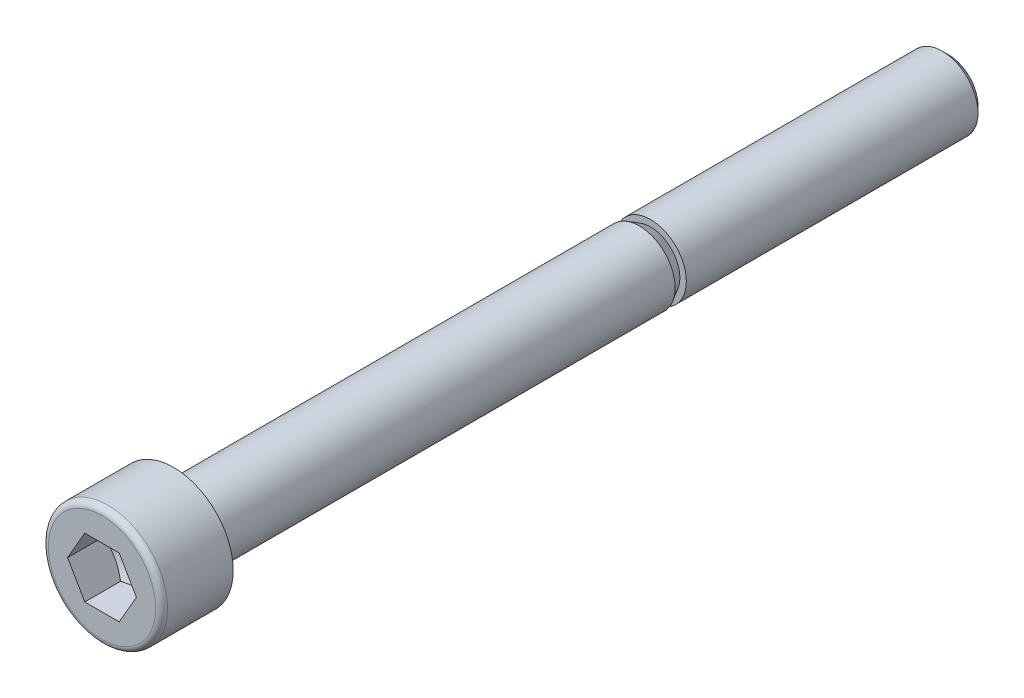
ISO-10303-21;
HEADER;
FILE_DESCRIPTION(('STEP AP214'),'2;1');
FILE_NAME('part.step','',(''),(''),'','','');
FILE_SCHEMA(('AUTOMOTIVE_DESIGN { 1 0 10303 214 1 1 1 1 }'));
ENDSEC;
DATA;
#1=APPLICATION_CONTEXT('core data for automotive mechanical design processes');
#2=APPLICATION_PROTOCOL_DEFINITION('international standard','automotive_design',2000,#1);
#3=PRODUCT_CONTEXT('',#1,'mechanical');
#4=PRODUCT('Part','Part','',(#3));
#5=PRODUCT_RELATED_PRODUCT_CATEGORY('part','',(#4));
#6=PRODUCT_DEFINITION_FORMATION('','',#4);
#7=PRODUCT_DEFINITION_CONTEXT('part definition',#1,'design');
#8=PRODUCT_DEFINITION('design','',#6,#7);
#9=PRODUCT_DEFINITION_SHAPE('','',#8);
#10=(LENGTH_UNIT() NAMED_UNIT(*) SI_UNIT(.MILLI.,.METRE.));
#11=(NAMED_UNIT(*) PLANE_ANGLE_UNIT() SI_UNIT($,.RADIAN.));
#12=(NAMED_UNIT(*) SI_UNIT($,.STERADIAN.) SOLID_ANGLE_UNIT());
#13=UNCERTAINTY_MEASURE_WITH_UNIT(LENGTH_MEASURE(1.E-05),#10,'distance_accuracy_value','');
#14=(GEOMETRIC_REPRESENTATION_CONTEXT(3) GLOBAL_UNCERTAINTY_ASSIGNED_CONTEXT((#13)) GLOBAL_UNIT_ASSIGNED_CONTEXT((#10,
#11,#12)) REPRESENTATION_CONTEXT('',''));
#15=CARTESIAN_POINT('',(0.,0.,0.));
#16=DIRECTION('',(0.,0.,1.));
#17=DIRECTION('',(1.,0.,0.));
#18=AXIS2_PLACEMENT_3D('',#15,#16,#17);
#19=CARTESIAN_POINT('',(0.,0.,6.));
#20=DIRECTION('',(0.,0.,1.));
#21=DIRECTION('',(1.,0.,0.));
#22=AXIS2_PLACEMENT_3D('',#19,#20,#21);
#23=PLANE('',#22);
#24=CARTESIAN_POINT('',(0.,0.,6.));
#25=DIRECTION('',(0.,0.,1.));
#26=DIRECTION('',(1.,0.,0.));
#27=AXIS2_PLACEMENT_3D('',#24,#25,#26);
#28=CIRCLE('',#27,4.5);
#29=CARTESIAN_POINT('',(4.5,0.,6.));
#30=VERTEX_POINT('',#29);
#31=EDGE_CURVE('E11',#30,#30,#28,.T.);
#32=ORIENTED_EDGE('',*,*,#31,.T.);
#33=EDGE_LOOP('',(#32));
#34=FACE_BOUND('',#33,.T.);
#35=DIRECTION('',(1.,0.,0.));
#36=VECTOR('',#35,1.);
#37=CARTESIAN_POINT('',(-1.443375,2.49999883437473,6.));
#38=LINE('',#37,#36);
#39=CARTESIAN_POINT('',(-1.443375,2.49999883437473,6.));
#40=VERTEX_POINT('',#39);
#41=CARTESIAN_POINT('',(1.443375,2.49999883437473,6.));
#42=VERTEX_POINT('',#41);
#43=EDGE_CURVE('E92',#40,#42,#38,.T.);
#44=ORIENTED_EDGE('',*,*,#43,.T.);
#45=DIRECTION('',(0.5,-0.866025403784439,0.));
#46=VECTOR('',#45,1.);
#47=CARTESIAN_POINT('',(1.443375,2.49999883437473,6.));
#48=LINE('',#47,#46);
#49=CARTESIAN_POINT('',(2.88675,0.,6.));
#50=VERTEX_POINT('',#49);
#51=EDGE_CURVE('E31',#42,#50,#48,.T.);
#52=ORIENTED_EDGE('',*,*,#51,.T.);
#53=DIRECTION('',(-0.5,-0.866025403784439,0.));
#54=VECTOR('',#53,1.);
#55=CARTESIAN_POINT('',(2.88675,0.,6.));
#56=LINE('',#55,#54);
#57=CARTESIAN_POINT('',(1.443375,-2.49999883437473,6.));
#58=VERTEX_POINT('',#57);
#59=EDGE_CURVE('E169',#50,#58,#56,.T.);
#60=ORIENTED_EDGE('',*,*,#59,.T.);
#61=DIRECTION('',(-1.,0.,0.));
#62=VECTOR('',#61,1.);
#63=CARTESIAN_POINT('',(1.443375,-2.49999883437473,6.));
#64=LINE('',#63,#62);
#65=CARTESIAN_POINT('',(-1.443375,-2.49999883437473,6.));
#66=VERTEX_POINT('',#65);
#67=EDGE_CURVE('E165',#58,#66,#64,.T.);
#68=ORIENTED_EDGE('',*,*,#67,.T.);
#69=DIRECTION('',(-0.5,0.866025403784439,0.));
#70=VECTOR('',#69,1.);
#71=CARTESIAN_POINT('',(-1.443375,-2.49999883437473,6.));
#72=LINE('',#71,#70);
#73=CARTESIAN_POINT('',(-2.88675,0.,6.));
#74=VERTEX_POINT('',#73);
#75=EDGE_CURVE('E160',#66,#74,#72,.T.);
#76=ORIENTED_EDGE('',*,*,#75,.T.);
#77=DIRECTION('',(0.5,0.866025403784439,0.));
#78=VECTOR('',#77,1.);
#79=CARTESIAN_POINT('',(-2.88675,0.,6.));
#80=LINE('',#79,#78);
#81=EDGE_CURVE('E96',#74,#40,#80,.T.);
#82=ORIENTED_EDGE('',*,*,#81,.T.);
#83=EDGE_LOOP('',(#44,#52,#60,#68,#76,#82));
#84=FACE_BOUND('',#83,.T.);
#85=ADVANCED_FACE('F17',(#34,#84),#23,.T.);
#86=CARTESIAN_POINT('',(0.,0.,5.5));
#87=DIRECTION('',(0.,0.,1.));
#88=DIRECTION('',(1.,0.,0.));
#89=AXIS2_PLACEMENT_3D('',#86,#87,#88);
#90=TOROIDAL_SURFACE('',#89,4.5,0.5);
#91=ORIENTED_EDGE('',*,*,#31,.F.);
#92=EDGE_LOOP('',(#91));
#93=FACE_BOUND('',#92,.T.);
#94=CARTESIAN_POINT('',(0.,0.,5.5));
#95=DIRECTION('',(0.,0.,1.));
#96=DIRECTION('',(1.,0.,0.));
#97=AXIS2_PLACEMENT_3D('',#94,#95,#96);
#98=CIRCLE('',#97,5.);
#99=CARTESIAN_POINT('',(5.,0.,5.5));
#100=VERTEX_POINT('',#99);
#101=EDGE_CURVE('E24',#100,#100,#98,.T.);
#102=ORIENTED_EDGE('',*,*,#101,.T.);
#103=EDGE_LOOP('',(#102));
#104=FACE_BOUND('',#103,.T.);
#105=ADVANCED_FACE('F133',(#93,#104),#90,.T.);
#106=CARTESIAN_POINT('',(0.,0.,6.));
#107=DIRECTION('',(0.,0.,1.));
#108=DIRECTION('',(1.,0.,0.));
#109=AXIS2_PLACEMENT_3D('',#106,#107,#108);
#110=CYLINDRICAL_SURFACE('',#109,5.);
#111=CARTESIAN_POINT('',(0.,0.,0.));
#112=DIRECTION('',(0.,0.,1.));
#113=DIRECTION('',(1.,0.,0.));
#114=AXIS2_PLACEMENT_3D('',#111,#112,#113);
#115=CIRCLE('',#114,5.);
#116=CARTESIAN_POINT('',(5.,0.,0.));
#117=VERTEX_POINT('',#116);
#118=EDGE_CURVE('E128',#117,#117,#115,.T.);
#119=ORIENTED_EDGE('',*,*,#118,.T.);
#120=EDGE_LOOP('',(#119));
#121=FACE_BOUND('',#120,.T.);
#122=ORIENTED_EDGE('',*,*,#101,.F.);
#123=EDGE_LOOP('',(#122));
#124=FACE_BOUND('',#123,.T.);
#125=ADVANCED_FACE('F135',(#121,#124),#110,.T.);
#126=CARTESIAN_POINT('',(0.,5.,0.));
#127=DIRECTION('',(0.,0.,-1.));
#128=DIRECTION('',(-1.,0.,0.));
#129=AXIS2_PLACEMENT_3D('',#126,#127,#128);
#130=PLANE('',#129);
#131=CARTESIAN_POINT('',(0.,0.,0.));
#132=DIRECTION('',(0.,0.,1.));
#133=DIRECTION('',(1.,0.,0.));
#134=AXIS2_PLACEMENT_3D('',#131,#132,#133);
#135=CIRCLE('',#134,3.3);
#136=CARTESIAN_POINT('',(3.3,0.,0.));
#137=VERTEX_POINT('',#136);
#138=EDGE_CURVE('E125',#137,#137,#135,.T.);
#139=ORIENTED_EDGE('',*,*,#138,.T.);
#140=EDGE_LOOP('',(#139));
#141=FACE_BOUND('',#140,.T.);
#142=ORIENTED_EDGE('',*,*,#118,.F.);
#143=EDGE_LOOP('',(#142));
#144=FACE_BOUND('',#143,.T.);
#145=ADVANCED_FACE('F137',(#141,#144),#130,.T.);
#146=CARTESIAN_POINT('',(0.,0.,-0.3));
#147=DIRECTION('',(0.,0.,1.));
#148=DIRECTION('',(1.,0.,0.));
#149=AXIS2_PLACEMENT_3D('',#146,#147,#148);
#150=TOROIDAL_SURFACE('',#149,3.3,0.3);
#151=CARTESIAN_POINT('',(0.,0.,-0.3));
#152=DIRECTION('',(0.,0.,1.));
#153=DIRECTION('',(1.,0.,0.));
#154=AXIS2_PLACEMENT_3D('',#151,#152,#153);
#155=CIRCLE('',#154,3.);
#156=CARTESIAN_POINT('',(3.,0.,-0.3));
#157=VERTEX_POINT('',#156);
#158=EDGE_CURVE('E122',#157,#157,#155,.T.);
#159=ORIENTED_EDGE('',*,*,#158,.T.);
#160=EDGE_LOOP('',(#159));
#161=FACE_BOUND('',#160,.T.);
#162=ORIENTED_EDGE('',*,*,#138,.F.);
#163=EDGE_LOOP('',(#162));
#164=FACE_BOUND('',#163,.T.);
#165=ADVANCED_FACE('F145',(#161,#164),#150,.F.);
#166=CARTESIAN_POINT('',(0.,0.,6.));
#167=DIRECTION('',(0.,0.,1.));
#168=DIRECTION('',(1.,0.,0.));
#169=AXIS2_PLACEMENT_3D('',#166,#167,#168);
#170=CYLINDRICAL_SURFACE('',#169,3.);
#171=CARTESIAN_POINT('',(0.,0.,-39.0625275004033));
#172=DIRECTION('',(0.,0.,1.));
#173=DIRECTION('',(1.,0.,0.));
#174=AXIS2_PLACEMENT_3D('',#171,#172,#173);
#175=CIRCLE('',#174,3.);
#176=CARTESIAN_POINT('',(3.,0.,-39.0625275004033));
#177=VERTEX_POINT('',#176);
#178=EDGE_CURVE('E119',#177,#177,#175,.T.);
#179=ORIENTED_EDGE('',*,*,#178,.T.);
#180=EDGE_LOOP('',(#179));
#181=FACE_BOUND('',#180,.T.);
#182=ORIENTED_EDGE('',*,*,#158,.F.);
#183=EDGE_LOOP('',(#182));
#184=FACE_BOUND('',#183,.T.);
#185=ADVANCED_FACE('F346',(#181,#184),#170,.T.);
#186=CARTESIAN_POINT('',(0.,0.,-39.0625275004033));
#187=DIRECTION('',(0.,0.,1.));
#188=DIRECTION('',(1.,0.,0.));
#189=AXIS2_PLACEMENT_3D('',#186,#187,#188);
#190=CONICAL_SURFACE('',#189,3.,0.523598775598299);
#191=CARTESIAN_POINT('',(0.,0.,-40.));
#192=DIRECTION('',(0.,0.,1.));
#193=DIRECTION('',(1.,0.,0.));
#194=AXIS2_PLACEMENT_3D('',#191,#192,#193);
#195=CIRCLE('',#194,2.45875);
#196=CARTESIAN_POINT('',(2.45875,0.,-40.));
#197=VERTEX_POINT('',#196);
#198=EDGE_CURVE('E116',#197,#197,#195,.T.);
#199=ORIENTED_EDGE('',*,*,#198,.T.);
#200=EDGE_LOOP('',(#199));
#201=FACE_BOUND('',#200,.T.);
#202=ORIENTED_EDGE('',*,*,#178,.F.);
#203=EDGE_LOOP('',(#202));
#204=FACE_BOUND('',#203,.T.);
#205=ADVANCED_FACE('F337',(#201,#204),#190,.T.);
#206=CARTESIAN_POINT('',(0.,2.45875,-40.));
#207=DIRECTION('',(0.,0.,1.));
#208=DIRECTION('',(1.,0.,0.));
#209=AXIS2_PLACEMENT_3D('',#206,#207,#208);
#210=PLANE('',#209);
#211=CARTESIAN_POINT('',(0.,0.,-40.));
#212=DIRECTION('',(0.,0.,1.));
#213=DIRECTION('',(1.,0.,0.));
#214=AXIS2_PLACEMENT_3D('',#211,#212,#213);
#215=CIRCLE('',#214,3.);
#216=CARTESIAN_POINT('',(3.,0.,-40.));
#217=VERTEX_POINT('',#216);
#218=EDGE_CURVE('E113',#217,#217,#215,.T.);
#219=ORIENTED_EDGE('',*,*,#218,.T.);
#220=EDGE_LOOP('',(#219));
#221=FACE_BOUND('',#220,.T.);
#222=ORIENTED_EDGE('',*,*,#198,.F.);
#223=EDGE_LOOP('',(#222));
#224=FACE_BOUND('',#223,.T.);
#225=ADVANCED_FACE('F322',(#221,#224),#210,.T.);
#226=CARTESIAN_POINT('',(0.,0.,6.));
#227=DIRECTION('',(0.,0.,1.));
#228=DIRECTION('',(1.,0.,0.));
#229=AXIS2_PLACEMENT_3D('',#226,#227,#228);
#230=CYLINDRICAL_SURFACE('',#229,3.);
#231=CARTESIAN_POINT('',(0.,0.,-64.45875));
#232=DIRECTION('',(0.,0.,1.));
#233=DIRECTION('',(1.,0.,0.));
#234=AXIS2_PLACEMENT_3D('',#231,#232,#233);
#235=CIRCLE('',#234,3.);
#236=CARTESIAN_POINT('',(3.,0.,-64.45875));
#237=VERTEX_POINT('',#236);
#238=EDGE_CURVE('E110',#237,#237,#235,.T.);
#239=ORIENTED_EDGE('',*,*,#238,.T.);
#240=EDGE_LOOP('',(#239));
#241=FACE_BOUND('',#240,.T.);
#242=ORIENTED_EDGE('',*,*,#218,.F.);
#243=EDGE_LOOP('',(#242));
#244=FACE_BOUND('',#243,.T.);
#245=ADVANCED_FACE('F311',(#241,#244),#230,.T.);
#246=CARTESIAN_POINT('',(0.,0.,-64.45875));
#247=DIRECTION('',(0.,0.,1.));
#248=DIRECTION('',(1.,0.,0.));
#249=AXIS2_PLACEMENT_3D('',#246,#247,#248);
#250=CONICAL_SURFACE('',#249,3.,0.785398163397443);
#251=CARTESIAN_POINT('',(0.,0.,-65.));
#252=DIRECTION('',(0.,0.,1.));
#253=DIRECTION('',(1.,0.,0.));
#254=AXIS2_PLACEMENT_3D('',#251,#252,#253);
#255=CIRCLE('',#254,2.45875);
#256=CARTESIAN_POINT('',(2.45875,0.,-65.));
#257=VERTEX_POINT('',#256);
#258=EDGE_CURVE('E107',#257,#257,#255,.T.);
#259=ORIENTED_EDGE('',*,*,#258,.T.);
#260=EDGE_LOOP('',(#259));
#261=FACE_BOUND('',#260,.T.);
#262=ORIENTED_EDGE('',*,*,#238,.F.);
#263=EDGE_LOOP('',(#262));
#264=FACE_BOUND('',#263,.T.);
#265=ADVANCED_FACE('F303',(#261,#264),#250,.T.);
#266=CARTESIAN_POINT('',(0.,2.45875,-65.));
#267=DIRECTION('',(0.,0.,-1.));
#268=DIRECTION('',(-1.,0.,0.));
#269=AXIS2_PLACEMENT_3D('',#266,#267,#268);
#270=PLANE('',#269);
#271=ORIENTED_EDGE('',*,*,#258,.F.);
#272=EDGE_LOOP('',(#271));
#273=FACE_BOUND('',#272,.T.);
#274=ADVANCED_FACE('F225',(#273),#270,.T.);
#275=CARTESIAN_POINT('',(1.443375,2.49999883437473,1.33333411041685));
#276=DIRECTION('',(-0.866025403784439,-0.5,0.));
#277=DIRECTION('',(-0.5,0.866025403784439,0.));
#278=AXIS2_PLACEMENT_3D('',#275,#276,#277);
#279=PLANE('',#278);
#280=DIRECTION('',(0.,0.,1.));
#281=VECTOR('',#280,1.);
#282=CARTESIAN_POINT('',(2.88675,0.,1.33333411041685));
#283=LINE('',#282,#281);
#284=CARTESIAN_POINT('',(2.88675,0.,3.));
#285=VERTEX_POINT('',#284);
#286=EDGE_CURVE('E105',#285,#50,#283,.T.);
#287=ORIENTED_EDGE('',*,*,#286,.T.);
#288=ORIENTED_EDGE('',*,*,#51,.F.);
#289=DIRECTION('',(0.,0.,1.));
#290=VECTOR('',#289,1.);
#291=CARTESIAN_POINT('',(1.443375,2.49999883437473,1.33333411041685));
#292=LINE('',#291,#290);
#293=CARTESIAN_POINT('',(1.443375,2.49999883437473,3.));
#294=VERTEX_POINT('',#293);
#295=EDGE_CURVE('E86',#294,#42,#292,.T.);
#296=ORIENTED_EDGE('',*,*,#295,.F.);
#297=CARTESIAN_POINT('',(2.88675011547006,-1.99999999863357E-07,3.00000006666667));
#298=CARTESIAN_POINT('',(2.82332252366581,0.10985961160669,2.96336950967828));
#299=CARTESIAN_POINT('',(2.75934742579574,0.220667731536841,2.93005593436152));
#300=CARTESIAN_POINT('',(2.63028954387127,0.444202540147256,2.87190808727666));
#301=CARTESIAN_POINT('',(2.56520446745334,0.556933199317605,2.84709438377072));
#302=CARTESIAN_POINT('',(2.43584088140159,0.780997503008549,2.80847006268835));
#303=CARTESIAN_POINT('',(2.37158227044588,0.892296682007636,2.7944023489199));
#304=CARTESIAN_POINT('',(2.24276284805613,1.11541846658835,2.77761157054617));
#305=CARTESIAN_POINT('',(2.17820250452486,1.22724026173863,2.77487459839365));
#306=CARTESIAN_POINT('',(2.05757841328359,1.43616731638533,2.78058295689796));
#307=CARTESIAN_POINT('',(2.00149656500914,1.53330392697905,2.7876266963322));
#308=CARTESIAN_POINT('',(1.8896982234341,1.72694433478895,2.80994670830941));
#309=CARTESIAN_POINT('',(1.83398211652594,1.82344746275382,2.82523059787334));
#310=CARTESIAN_POINT('',(1.72195345954662,2.01748678854571,2.86343736615338));
#311=CARTESIAN_POINT('',(1.66565508107193,2.11499844044762,2.88652212541071));
#312=CARTESIAN_POINT('',(1.55389777191142,2.3085677780308,2.93891477048972));
#313=CARTESIAN_POINT('',(1.49843741058811,2.40462794164891,2.96821035401504));
#314=CARTESIAN_POINT('',(1.44337488452994,2.49999903437473,3.00000006666667));
#315=B_SPLINE_CURVE_WITH_KNOTS('',3,(#297,#298,#299,#300,#301,#302,#303,#304,#305,#306,#307,
#308,#309,#310,#311,#312,#313,#314),.UNSPECIFIED.,.F.,.F.,(4,2,2,2,2,2,2,2,4),(0.,
0.396269845497158,0.793491933375094,1.18088400346178,1.56780044062153,1.90463400294076,
2.24177946228527,2.58640119548574,2.93034658115087),.UNSPECIFIED.);
#316=EDGE_CURVE('E79',#285,#294,#315,.T.);
#317=ORIENTED_EDGE('',*,*,#316,.F.);
#318=EDGE_LOOP('',(#287,#288,#296,#317));
#319=FACE_BOUND('',#318,.T.);
#320=ADVANCED_FACE('F87',(#319),#279,.T.);
#321=CARTESIAN_POINT('',(2.88675,0.,1.33333411041685));
#322=DIRECTION('',(-0.866025403784439,0.5,0.));
#323=DIRECTION('',(0.5,0.866025403784439,0.));
#324=AXIS2_PLACEMENT_3D('',#321,#322,#323);
#325=PLANE('',#324);
#326=DIRECTION('',(0.,0.,1.));
#327=VECTOR('',#326,1.);
#328=CARTESIAN_POINT('',(1.443375,-2.49999883437473,1.33333411041685));
#329=LINE('',#328,#327);
#330=CARTESIAN_POINT('',(1.443375,-2.49999883437473,3.));
#331=VERTEX_POINT('',#330);
#332=EDGE_CURVE('E103',#331,#58,#329,.T.);
#333=ORIENTED_EDGE('',*,*,#332,.T.);
#334=ORIENTED_EDGE('',*,*,#59,.F.);
#335=ORIENTED_EDGE('',*,*,#286,.F.);
#336=CARTESIAN_POINT('',(1.44337488452995,-2.49999903437473,3.00000006666667));
#337=CARTESIAN_POINT('',(1.50680247633419,-2.39013922276804,2.96336950967828));
#338=CARTESIAN_POINT('',(1.57077757420426,-2.27933110283789,2.93005593436152));
#339=CARTESIAN_POINT('',(1.69983545612873,-2.05579629422747,2.87190808727666));
#340=CARTESIAN_POINT('',(1.76492053254666,-1.94306563505712,2.84709438377072));
#341=CARTESIAN_POINT('',(1.89428411859841,-1.71900133136618,2.80847006268835));
#342=CARTESIAN_POINT('',(1.95854272955412,-1.60770215236709,2.7944023489199));
#343=CARTESIAN_POINT('',(2.08736215194387,-1.38458036778637,2.77761157054617));
#344=CARTESIAN_POINT('',(2.15192249547514,-1.2727585726361,2.77487459839365));
#345=CARTESIAN_POINT('',(2.27254658671641,-1.06383151798939,2.78058295689796));
#346=CARTESIAN_POINT('',(2.32862843499086,-0.96669490739568,2.7876266963322));
#347=CARTESIAN_POINT('',(2.4404267765659,-0.773054499585779,2.8099467083094));
#348=CARTESIAN_POINT('',(2.49614288347406,-0.676551371620907,2.82523059787334));
#349=CARTESIAN_POINT('',(2.60817154045338,-0.48251204582902,2.86343736615338));
#350=CARTESIAN_POINT('',(2.66446991892807,-0.385000393927105,2.88652212541071));
#351=CARTESIAN_POINT('',(2.77622722808858,-0.191431056343928,2.93891477048972));
#352=CARTESIAN_POINT('',(2.83168758941189,-0.0953708927258217,2.96821035401504));
#353=CARTESIAN_POINT('',(2.88675011547006,1.99999999976406E-07,3.00000006666667));
#354=B_SPLINE_CURVE_WITH_KNOTS('',3,(#336,#337,#338,#339,#340,#341,#342,#343,#344,#345,#346,
#347,#348,#349,#350,#351,#352,#353),.UNSPECIFIED.,.F.,.F.,(4,2,2,2,2,2,2,2,4),(0.,
0.396269845497159,0.793491933375095,1.18088400346178,1.56780044062153,1.90463400294076,
2.24177946228527,2.58640119548574,2.93034658115087),.UNSPECIFIED.);
#355=EDGE_CURVE('E83',#331,#285,#354,.T.);
#356=ORIENTED_EDGE('',*,*,#355,.F.);
#357=EDGE_LOOP('',(#333,#334,#335,#356));
#358=FACE_BOUND('',#357,.T.);
#359=ADVANCED_FACE('F216',(#358),#325,.T.);
#360=CARTESIAN_POINT('',(1.443375,-2.49999883437473,1.33333411041685));
#361=DIRECTION('',(0.,1.,0.));
#362=DIRECTION('',(1.,0.,0.));
#363=AXIS2_PLACEMENT_3D('',#360,#361,#362);
#364=PLANE('',#363);
#365=DIRECTION('',(0.,0.,1.));
#366=VECTOR('',#365,1.);
#367=CARTESIAN_POINT('',(-1.443375,-2.49999883437473,1.33333411041685));
#368=LINE('',#367,#366);
#369=CARTESIAN_POINT('',(-1.443375,-2.49999883437473,3.));
#370=VERTEX_POINT('',#369);
#371=EDGE_CURVE('E101',#370,#66,#368,.T.);
#372=ORIENTED_EDGE('',*,*,#371,.T.);
#373=ORIENTED_EDGE('',*,*,#67,.F.);
#374=ORIENTED_EDGE('',*,*,#332,.F.);
#375=CARTESIAN_POINT('',(-3.73786106214978,-2.49999883437473,3.92958778907324));
#376=CARTESIAN_POINT('',(-3.62896491195938,-2.49999883437473,3.87734398831161));
#377=CARTESIAN_POINT('',(-3.51980131110672,-2.49999883437473,3.82564701620672));
#378=CARTESIAN_POINT('',(-3.30079453275696,-2.49999883437473,3.72366066581967));
#379=CARTESIAN_POINT('',(-3.19095123199839,-2.49999883437473,3.67337155256083));
#380=CARTESIAN_POINT('',(-2.96980741137606,-2.49999883437473,3.57423266172552));
#381=CARTESIAN_POINT('',(-2.85850208851781,-2.49999883437473,3.5253935570836));
#382=CARTESIAN_POINT('',(-2.63494533066189,-2.49999883437473,3.42993961665011));
#383=CARTESIAN_POINT('',(-2.52269394848717,-2.49999883437473,3.38332465762953));
#384=CARTESIAN_POINT('',(-2.2960796228752,-2.49999883437473,3.29252281771904));
#385=CARTESIAN_POINT('',(-2.18170681392527,-2.49999883437473,3.2483604168365));
#386=CARTESIAN_POINT('',(-1.95158478593381,-2.49999883437473,3.16370836718421));
#387=CARTESIAN_POINT('',(-1.83583541308941,-2.49999883437473,3.12321913326025));
#388=CARTESIAN_POINT('',(-1.60304799958039,-2.49999883437473,3.04706130714345));
#389=CARTESIAN_POINT('',(-1.4860136544433,-2.49999883437473,3.01138153954989));
#390=CARTESIAN_POINT('',(-1.25028155584969,-2.49999883437473,2.94604587235114));
#391=CARTESIAN_POINT('',(-1.13158421230429,-2.49999883437473,2.91638851527048));
#392=CARTESIAN_POINT('',(-0.892146141983619,-2.49999883437473,2.86451911091829));
#393=CARTESIAN_POINT('',(-0.771400115486069,-2.49999883437473,2.84233105195638));
#394=CARTESIAN_POINT('',(-0.528550538126974,-2.49999883437473,2.8070567548414));
#395=CARTESIAN_POINT('',(-0.406446967923683,-2.49999883437473,2.7939706465386));
#396=CARTESIAN_POINT('',(-0.162227421037293,-2.49999883437473,2.77805851853028));
#397=CARTESIAN_POINT('',(-0.0401151733531879,-2.49999883437473,2.77517671003708));
#398=CARTESIAN_POINT('',(0.203885891243259,-2.49999883437473,2.77978959871521));
#399=CARTESIAN_POINT('',(0.325774751512606,-2.49999883437473,2.78728200631532));
#400=CARTESIAN_POINT('',(0.536617165080476,-2.49999883437473,2.80870547357712));
#401=CARTESIAN_POINT('',(0.625806204585235,-2.49999883437473,2.82042640123085));
#402=CARTESIAN_POINT('',(0.803437024790562,-2.49999883437473,2.84861382064688));
#403=CARTESIAN_POINT('',(0.891878680031716,-2.49999883437473,2.86508109348135));
#404=CARTESIAN_POINT('',(1.1562492807378,-2.49999883437473,2.92077504184743));
#405=CARTESIAN_POINT('',(1.3308708069745,-2.49999883437473,2.96625356320288));
#406=CARTESIAN_POINT('',(1.59190160301469,-2.49999883437473,3.04393162478608));
#407=CARTESIAN_POINT('',(1.67969059973094,-2.49999883437473,3.0717495689676));
#408=CARTESIAN_POINT('',(1.85442096143946,-2.49999883437473,3.12997740734101));
#409=CARTESIAN_POINT('',(1.94136225311569,-2.49999883437473,3.16038752354637));
#410=CARTESIAN_POINT('',(2.1139610250156,-2.49999883437473,3.22316216485984));
#411=CARTESIAN_POINT('',(2.19962301770649,-2.49999883437473,3.25551440549188));
#412=CARTESIAN_POINT('',(2.37023194830679,-2.49999883437473,3.32197432045096));
#413=CARTESIAN_POINT('',(2.45517911361762,-2.49999883437473,3.35608140990558));
#414=CARTESIAN_POINT('',(2.53982745281954,-2.49999883437473,3.3908988248281));
#415=B_SPLINE_CURVE_WITH_KNOTS('',3,(#375,#376,#377,#378,#379,#380,#381,#382,#383,#384,#385,
#386,#387,#388,#389,#390,#391,#392,#393,#394,#395,#396,#397,#398,#399,#400,#401,#402,#403,#404,
#405,#406,#407,#408,#409,#410,#411,#412,#413,#414),.UNSPECIFIED.,.F.,.F.,(4,2,2,2,2,2,2,2,2,2,2,
2,2,2,2,2,2,2,2,4),(0.,0.362345077461351,0.724757912306451,1.08938530048732,1.45399246293536,
1.82175226930555,2.18955355872751,2.55648491480033,2.92332736420018,3.29133696448628,
3.65935181476395,4.02535152666688,4.39127047595122,4.66100477488141,4.93078348742953,
5.47140222651042,5.74765583222639,6.02393312223645,6.29861688003657,6.57320967433308),.UNSPECIFIED.);
#416=EDGE_CURVE('E207',#370,#331,#415,.T.);
#417=ORIENTED_EDGE('',*,*,#416,.F.);
#418=EDGE_LOOP('',(#372,#373,#374,#417));
#419=FACE_BOUND('',#418,.T.);
#420=ADVANCED_FACE('F212',(#419),#364,.T.);
#421=CARTESIAN_POINT('',(-1.443375,-2.49999883437473,1.33333411041685));
#422=DIRECTION('',(0.866025403784439,0.5,0.));
#423=DIRECTION('',(0.5,-0.866025403784439,0.));
#424=AXIS2_PLACEMENT_3D('',#421,#422,#423);
#425=PLANE('',#424);
#426=DIRECTION('',(0.,0.,1.));
#427=VECTOR('',#426,1.);
#428=CARTESIAN_POINT('',(-2.88675,0.,1.33333411041685));
#429=LINE('',#428,#427);
#430=CARTESIAN_POINT('',(-2.88675,0.,3.));
#431=VERTEX_POINT('',#430);
#432=EDGE_CURVE('E94',#431,#74,#429,.T.);
#433=ORIENTED_EDGE('',*,*,#432,.T.);
#434=ORIENTED_EDGE('',*,*,#75,.F.);
#435=ORIENTED_EDGE('',*,*,#371,.F.);
#436=CARTESIAN_POINT('',(-2.88675011547006,2.E-07,3.00000006666667));
#437=CARTESIAN_POINT('',(-2.82332252366581,-0.109859611606689,2.96336950967828));
#438=CARTESIAN_POINT('',(-2.75934742579574,-0.220667731536841,2.93005593436152));
#439=CARTESIAN_POINT('',(-2.63028954387127,-0.444202540147256,2.87190808727666));
#440=CARTESIAN_POINT('',(-2.56520446745334,-0.556933199317605,2.84709438377072));
#441=CARTESIAN_POINT('',(-2.43584088140159,-0.78099750300855,2.80847006268835));
#442=CARTESIAN_POINT('',(-2.37158227044588,-0.892296682007636,2.7944023489199));
#443=CARTESIAN_POINT('',(-2.24276284805613,-1.11541846658835,2.77761157054617));
#444=CARTESIAN_POINT('',(-2.17820250452486,-1.22724026173863,2.77487459839365));
#445=CARTESIAN_POINT('',(-2.05757841328359,-1.43616731638533,2.78058295689796));
#446=CARTESIAN_POINT('',(-2.00149656500914,-1.53330392697905,2.7876266963322));
#447=CARTESIAN_POINT('',(-1.8896982234341,-1.72694433478895,2.80994670830941));
#448=CARTESIAN_POINT('',(-1.83398211652594,-1.82344746275382,2.82523059787334));
#449=CARTESIAN_POINT('',(-1.72195345954662,-2.01748678854571,2.86343736615338));
#450=CARTESIAN_POINT('',(-1.66565508107193,-2.11499844044762,2.88652212541071));
#451=CARTESIAN_POINT('',(-1.55389777191142,-2.3085677780308,2.93891477048972));
#452=CARTESIAN_POINT('',(-1.49843741058811,-2.40462794164891,2.96821035401504));
#453=CARTESIAN_POINT('',(-1.44337488452995,-2.49999903437473,3.00000006666667));
#454=B_SPLINE_CURVE_WITH_KNOTS('',3,(#436,#437,#438,#439,#440,#441,#442,#443,#444,#445,#446,
#447,#448,#449,#450,#451,#452,#453),.UNSPECIFIED.,.F.,.F.,(4,2,2,2,2,2,2,2,4),(0.,
0.396269845497158,0.793491933375094,1.18088400346178,1.56780044062153,1.90463400294076,
2.24177946228527,2.58640119548574,2.93034658115087),.UNSPECIFIED.);
#455=EDGE_CURVE('E202',#431,#370,#454,.T.);
#456=ORIENTED_EDGE('',*,*,#455,.F.);
#457=EDGE_LOOP('',(#433,#434,#435,#456));
#458=FACE_BOUND('',#457,.T.);
#459=ADVANCED_FACE('F215',(#458),#425,.T.);
#460=CARTESIAN_POINT('',(-2.88675,0.,1.33333411041685));
#461=DIRECTION('',(0.866025403784439,-0.5,0.));
#462=DIRECTION('',(-0.5,-0.866025403784439,0.));
#463=AXIS2_PLACEMENT_3D('',#460,#461,#462);
#464=PLANE('',#463);
#465=DIRECTION('',(0.,0.,1.));
#466=VECTOR('',#465,1.);
#467=CARTESIAN_POINT('',(-1.443375,2.49999883437473,1.33333411041685));
#468=LINE('',#467,#466);
#469=CARTESIAN_POINT('',(-1.443375,2.49999883437473,3.));
#470=VERTEX_POINT('',#469);
#471=EDGE_CURVE('E91',#470,#40,#468,.T.);
#472=ORIENTED_EDGE('',*,*,#471,.T.);
#473=ORIENTED_EDGE('',*,*,#81,.F.);
#474=ORIENTED_EDGE('',*,*,#432,.F.);
#475=CARTESIAN_POINT('',(-1.44337488452995,2.49999903437473,3.00000006666667));
#476=CARTESIAN_POINT('',(-1.50680247633419,2.39013922276804,2.96336950967828));
#477=CARTESIAN_POINT('',(-1.57077757420426,2.27933110283789,2.93005593436152));
#478=CARTESIAN_POINT('',(-1.69983545612874,2.05579629422747,2.87190808727665));
#479=CARTESIAN_POINT('',(-1.76492053254666,1.94306563505712,2.84709438377072));
#480=CARTESIAN_POINT('',(-1.89428411859841,1.71900133136618,2.80847006268835));
#481=CARTESIAN_POINT('',(-1.95854272955412,1.60770215236709,2.7944023489199));
#482=CARTESIAN_POINT('',(-2.08736215194387,1.38458036778637,2.77761157054617));
#483=CARTESIAN_POINT('',(-2.15192249547514,1.2727585726361,2.77487459839365));
#484=CARTESIAN_POINT('',(-2.27254658671641,1.06383151798939,2.78058295689796));
#485=CARTESIAN_POINT('',(-2.32862843499086,0.966694907395678,2.7876266963322));
#486=CARTESIAN_POINT('',(-2.4404267765659,0.773054499585779,2.8099467083094));
#487=CARTESIAN_POINT('',(-2.49614288347406,0.676551371620906,2.82523059787334));
#488=CARTESIAN_POINT('',(-2.60817154045338,0.48251204582902,2.86343736615338));
#489=CARTESIAN_POINT('',(-2.66446991892807,0.385000393927105,2.88652212541071));
#490=CARTESIAN_POINT('',(-2.77622722808858,0.191431056343928,2.93891477048972));
#491=CARTESIAN_POINT('',(-2.83168758941189,0.0953708927258217,2.96821035401504));
#492=CARTESIAN_POINT('',(-2.88675011547006,-2.00000000044562E-07,3.00000006666667));
#493=B_SPLINE_CURVE_WITH_KNOTS('',3,(#475,#476,#477,#478,#479,#480,#481,#482,#483,#484,#485,
#486,#487,#488,#489,#490,#491,#492),.UNSPECIFIED.,.F.,.F.,(4,2,2,2,2,2,2,2,4),(0.,
0.396269845497157,0.793491933375093,1.18088400346178,1.56780044062153,1.90463400294076,
2.24177946228527,2.58640119548574,2.93034658115087),.UNSPECIFIED.);
#494=EDGE_CURVE('E39',#470,#431,#493,.T.);
#495=ORIENTED_EDGE('',*,*,#494,.F.);
#496=EDGE_LOOP('',(#472,#473,#474,#495));
#497=FACE_BOUND('',#496,.T.);
#498=ADVANCED_FACE('F159',(#497),#464,.T.);
#499=CARTESIAN_POINT('',(-1.443375,2.49999883437473,1.33333411041685));
#500=DIRECTION('',(0.,-1.,0.));
#501=DIRECTION('',(-1.,0.,0.));
#502=AXIS2_PLACEMENT_3D('',#499,#500,#501);
#503=PLANE('',#502);
#504=ORIENTED_EDGE('',*,*,#295,.T.);
#505=ORIENTED_EDGE('',*,*,#43,.F.);
#506=ORIENTED_EDGE('',*,*,#471,.F.);
#507=CARTESIAN_POINT('',(-3.73786106214979,2.49999883437473,3.92958778907324));
#508=CARTESIAN_POINT('',(-3.62896491195938,2.49999883437473,3.87734398831161));
#509=CARTESIAN_POINT('',(-3.51980131110672,2.49999883437473,3.82564701620672));
#510=CARTESIAN_POINT('',(-3.30079453275696,2.49999883437473,3.72366066581967));
#511=CARTESIAN_POINT('',(-3.1909512319984,2.49999883437473,3.67337155256083));
#512=CARTESIAN_POINT('',(-2.96980741137607,2.49999883437473,3.57423266172552));
#513=CARTESIAN_POINT('',(-2.85850208851781,2.49999883437473,3.5253935570836));
#514=CARTESIAN_POINT('',(-2.6349453306619,2.49999883437473,3.42993961665011));
#515=CARTESIAN_POINT('',(-2.52269394848718,2.49999883437473,3.38332465762953));
#516=CARTESIAN_POINT('',(-2.2960796228752,2.49999883437473,3.29252281771904));
#517=CARTESIAN_POINT('',(-2.18170681392528,2.49999883437473,3.2483604168365));
#518=CARTESIAN_POINT('',(-1.95158478593381,2.49999883437473,3.16370836718421));
#519=CARTESIAN_POINT('',(-1.83583541308942,2.49999883437473,3.12321913326026));
#520=CARTESIAN_POINT('',(-1.60304799958039,2.49999883437473,3.04706130714345));
#521=CARTESIAN_POINT('',(-1.4860136544433,2.49999883437473,3.01138153954989));
#522=CARTESIAN_POINT('',(-1.2502815558497,2.49999883437473,2.94604587235114));
#523=CARTESIAN_POINT('',(-1.1315842123043,2.49999883437473,2.91638851527048));
#524=CARTESIAN_POINT('',(-0.892146141983622,2.49999883437473,2.86451911091829));
#525=CARTESIAN_POINT('',(-0.771400115486072,2.49999883437473,2.84233105195638));
#526=CARTESIAN_POINT('',(-0.528550538126977,2.49999883437473,2.8070567548414));
#527=CARTESIAN_POINT('',(-0.406446967923686,2.49999883437473,2.7939706465386));
#528=CARTESIAN_POINT('',(-0.162227421037296,2.49999883437473,2.77805851853028));
#529=CARTESIAN_POINT('',(-0.0401151733531905,2.49999883437473,2.77517671003708));
#530=CARTESIAN_POINT('',(0.203885891243256,2.49999883437473,2.77978959871521));
#531=CARTESIAN_POINT('',(0.325774751512604,2.49999883437473,2.78728200631532));
#532=CARTESIAN_POINT('',(0.536617165080473,2.49999883437473,2.80870547357712));
#533=CARTESIAN_POINT('',(0.625806204585233,2.49999883437473,2.82042640123085));
#534=CARTESIAN_POINT('',(0.80343702479056,2.49999883437473,2.84861382064688));
#535=CARTESIAN_POINT('',(0.891878680031713,2.49999883437473,2.86508109348135));
#536=CARTESIAN_POINT('',(1.1562492807378,2.49999883437473,2.92077504184743));
#537=CARTESIAN_POINT('',(1.3308708069745,2.49999883437473,2.96625356320288));
#538=CARTESIAN_POINT('',(1.59190160301469,2.49999883437473,3.04393162478608));
#539=CARTESIAN_POINT('',(1.67969059973094,2.49999883437473,3.0717495689676));
#540=CARTESIAN_POINT('',(1.85442096143945,2.49999883437473,3.12997740734101));
#541=CARTESIAN_POINT('',(1.94136225311568,2.49999883437473,3.16038752354637));
#542=CARTESIAN_POINT('',(2.1139610250156,2.49999883437473,3.22316216485984));
#543=CARTESIAN_POINT('',(2.19962301770648,2.49999883437473,3.25551440549188));
#544=CARTESIAN_POINT('',(2.37023194830679,2.49999883437473,3.32197432045096));
#545=CARTESIAN_POINT('',(2.45517911361761,2.49999883437473,3.35608140990557));
#546=CARTESIAN_POINT('',(2.53982745281954,2.49999883437473,3.3908988248281));
#547=B_SPLINE_CURVE_WITH_KNOTS('',3,(#507,#508,#509,#510,#511,#512,#513,#514,#515,#516,#517,
#518,#519,#520,#521,#522,#523,#524,#525,#526,#527,#528,#529,#530,#531,#532,#533,#534,#535,#536,
#537,#538,#539,#540,#541,#542,#543,#544,#545,#546),.UNSPECIFIED.,.F.,.F.,(4,2,2,2,2,2,2,2,2,2,2,
2,2,2,2,2,2,2,2,4),(0.,0.36234507746135,0.724757912306449,1.08938530048732,1.45399246293535,
1.82175226930555,2.18955355872751,2.55648491480033,2.92332736420018,3.29133696448628,
3.65935181476395,4.02535152666688,4.39127047595122,4.66100477488141,4.93078348742953,
5.47140222651042,5.74765583222639,6.02393312223645,6.29861688003657,6.57320967433308),.UNSPECIFIED.);
#548=EDGE_CURVE('E80',#294,#470,#547,.F.);
#549=ORIENTED_EDGE('',*,*,#548,.F.);
#550=EDGE_LOOP('',(#504,#505,#506,#549));
#551=FACE_BOUND('',#550,.T.);
#552=ADVANCED_FACE('F75',(#551),#503,.T.);
#553=CARTESIAN_POINT('',(0.,0.,1.33333411041685));
#554=DIRECTION('',(0.,0.,1.));
#555=DIRECTION('',(1.,0.,0.));
#556=AXIS2_PLACEMENT_3D('',#553,#554,#555);
#557=CONICAL_SURFACE('',#556,0.,1.0471975511966);
#558=CARTESIAN_POINT('',(0.,0.,1.33333411041685));
#559=VERTEX_POINT('',#558);
#560=VERTEX_LOOP('',#559);
#561=FACE_BOUND('',#560,.T.);
#562=ORIENTED_EDGE('',*,*,#316,.T.);
#563=ORIENTED_EDGE('',*,*,#548,.T.);
#564=ORIENTED_EDGE('',*,*,#494,.T.);
#565=ORIENTED_EDGE('',*,*,#455,.T.);
#566=ORIENTED_EDGE('',*,*,#416,.T.);
#567=ORIENTED_EDGE('',*,*,#355,.T.);
#568=EDGE_LOOP('',(#562,#563,#564,#565,#566,#567));
#569=FACE_BOUND('',#568,.T.);
#570=ADVANCED_FACE('F72',(#561,#569),#557,.F.);
#571=CLOSED_SHELL('',(#85,#105,#125,#145,#165,#185,#205,#225,#245,#265,#274,#320,#359,#420,#459,
#498,#552,#570));
#572=MANIFOLD_SOLID_BREP('B1',#571);
#573=ADVANCED_BREP_SHAPE_REPRESENTATION('',(#18,#572),#14);
#574=SHAPE_DEFINITION_REPRESENTATION(#9,#573);
ENDSEC;
END-ISO-10303-21;
